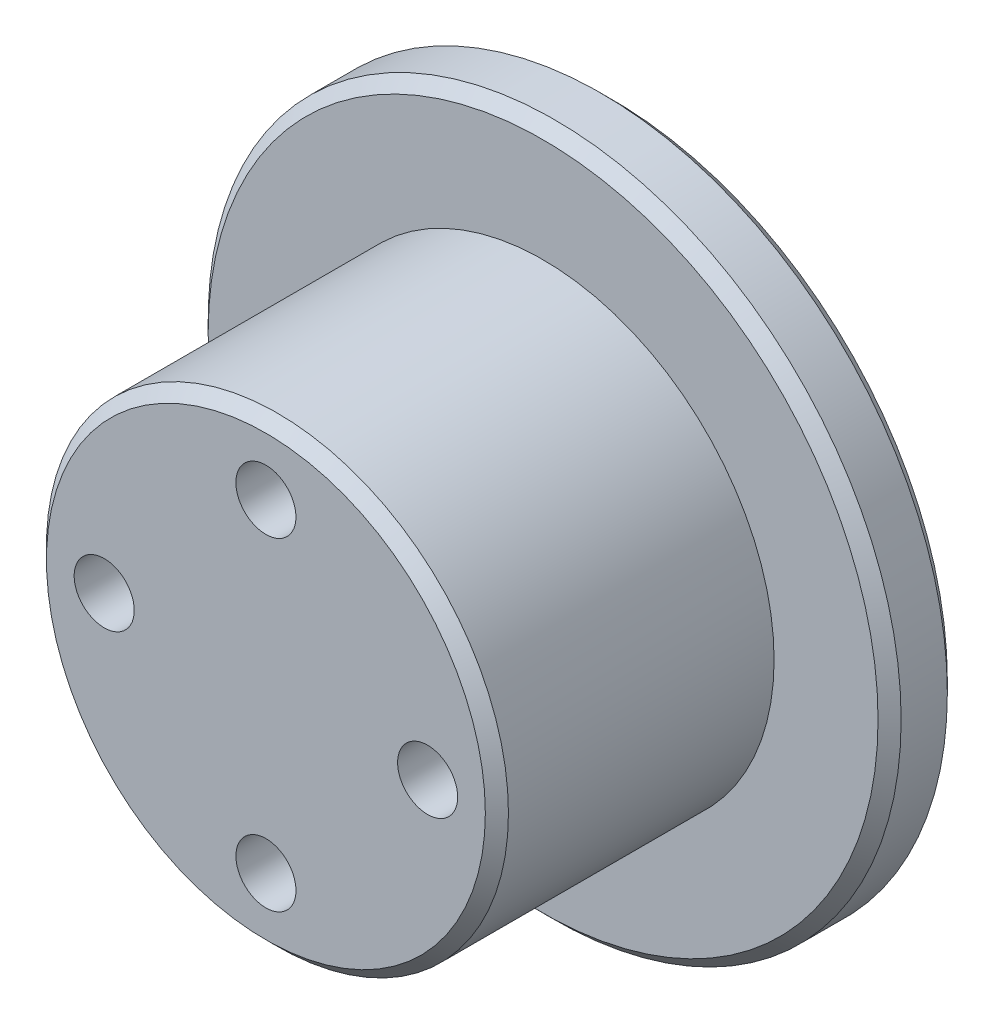
ISO-10303-21;
HEADER;
FILE_DESCRIPTION(('STEP AP214'),'2;1');
FILE_NAME('part.step','',(''),(''),'','','');
FILE_SCHEMA(('AUTOMOTIVE_DESIGN { 1 0 10303 214 1 1 1 1 }'));
ENDSEC;
DATA;
#1=APPLICATION_CONTEXT('core data for automotive mechanical design processes');
#2=APPLICATION_PROTOCOL_DEFINITION('international standard','automotive_design',2000,#1);
#3=PRODUCT_CONTEXT('',#1,'mechanical');
#4=PRODUCT('Part','Part','',(#3));
#5=PRODUCT_RELATED_PRODUCT_CATEGORY('part','',(#4));
#6=PRODUCT_DEFINITION_FORMATION('','',#4);
#7=PRODUCT_DEFINITION_CONTEXT('part definition',#1,'design');
#8=PRODUCT_DEFINITION('design','',#6,#7);
#9=PRODUCT_DEFINITION_SHAPE('','',#8);
#10=(LENGTH_UNIT() NAMED_UNIT(*) SI_UNIT(.MILLI.,.METRE.));
#11=(NAMED_UNIT(*) PLANE_ANGLE_UNIT() SI_UNIT($,.RADIAN.));
#12=(NAMED_UNIT(*) SI_UNIT($,.STERADIAN.) SOLID_ANGLE_UNIT());
#13=UNCERTAINTY_MEASURE_WITH_UNIT(LENGTH_MEASURE(1.E-05),#10,'distance_accuracy_value','');
#14=(GEOMETRIC_REPRESENTATION_CONTEXT(3) GLOBAL_UNCERTAINTY_ASSIGNED_CONTEXT((#13)) GLOBAL_UNIT_ASSIGNED_CONTEXT((#10,
#11,#12)) REPRESENTATION_CONTEXT('',''));
#15=CARTESIAN_POINT('',(0.,0.,0.));
#16=DIRECTION('',(0.,0.,1.));
#17=DIRECTION('',(1.,0.,0.));
#18=AXIS2_PLACEMENT_3D('',#15,#16,#17);
#19=CARTESIAN_POINT('',(0.,0.,3.));
#20=DIRECTION('',(0.,0.,-1.));
#21=DIRECTION('',(-1.,0.,0.));
#22=AXIS2_PLACEMENT_3D('',#19,#20,#21);
#23=CYLINDRICAL_SURFACE('',#22,15.);
#24=CARTESIAN_POINT('',(0.,0.,2.50000000000001));
#25=DIRECTION('',(0.,0.,1.));
#26=DIRECTION('',(1.,0.,0.));
#27=AXIS2_PLACEMENT_3D('',#24,#25,#26);
#28=CIRCLE('',#27,15.);
#29=CARTESIAN_POINT('',(15.,0.,2.50000000000001));
#30=VERTEX_POINT('',#29);
#31=EDGE_CURVE('E47',#30,#30,#28,.F.);
#32=ORIENTED_EDGE('',*,*,#31,.T.);
#33=EDGE_LOOP('',(#32));
#34=FACE_BOUND('',#33,.T.);
#35=CARTESIAN_POINT('',(0.,0.,0.500000000000002));
#36=DIRECTION('',(0.,0.,1.));
#37=DIRECTION('',(1.,0.,0.));
#38=AXIS2_PLACEMENT_3D('',#35,#36,#37);
#39=CIRCLE('',#38,15.);
#40=CARTESIAN_POINT('',(15.,0.,0.500000000000002));
#41=VERTEX_POINT('',#40);
#42=EDGE_CURVE('E52',#41,#41,#39,.T.);
#43=ORIENTED_EDGE('',*,*,#42,.T.);
#44=EDGE_LOOP('',(#43));
#45=FACE_BOUND('',#44,.T.);
#46=ADVANCED_FACE('F41',(#34,#45),#23,.T.);
#47=CARTESIAN_POINT('',(0.,0.,3.));
#48=DIRECTION('',(0.,0.,1.));
#49=DIRECTION('',(1.,0.,0.));
#50=AXIS2_PLACEMENT_3D('',#47,#48,#49);
#51=PLANE('',#50);
#52=CARTESIAN_POINT('',(0.,0.,3.));
#53=DIRECTION('',(0.,0.,1.));
#54=DIRECTION('',(1.,0.,0.));
#55=AXIS2_PLACEMENT_3D('',#52,#53,#54);
#56=CIRCLE('',#55,14.5);
#57=CARTESIAN_POINT('',(14.5,0.,3.));
#58=VERTEX_POINT('',#57);
#59=EDGE_CURVE('E60',#58,#58,#56,.T.);
#60=ORIENTED_EDGE('',*,*,#59,.T.);
#61=EDGE_LOOP('',(#60));
#62=FACE_BOUND('',#61,.T.);
#63=CARTESIAN_POINT('',(0.,0.,3.));
#64=DIRECTION('',(0.,0.,1.));
#65=DIRECTION('',(1.,0.,0.));
#66=AXIS2_PLACEMENT_3D('',#63,#64,#65);
#67=CIRCLE('',#66,10.);
#68=CARTESIAN_POINT('',(10.,0.,3.));
#69=VERTEX_POINT('',#68);
#70=EDGE_CURVE('E69',#69,#69,#67,.T.);
#71=ORIENTED_EDGE('',*,*,#70,.F.);
#72=EDGE_LOOP('',(#71));
#73=FACE_BOUND('',#72,.T.);
#74=ADVANCED_FACE('F130',(#62,#73),#51,.T.);
#75=CARTESIAN_POINT('',(0.,0.,0.));
#76=DIRECTION('',(0.,0.,1.));
#77=DIRECTION('',(1.,0.,0.));
#78=AXIS2_PLACEMENT_3D('',#75,#76,#77);
#79=PLANE('',#78);
#80=CARTESIAN_POINT('',(0.,0.,0.));
#81=DIRECTION('',(0.,0.,1.));
#82=DIRECTION('',(1.,0.,0.));
#83=AXIS2_PLACEMENT_3D('',#80,#81,#82);
#84=CIRCLE('',#83,14.5);
#85=CARTESIAN_POINT('',(14.5,0.,0.));
#86=VERTEX_POINT('',#85);
#87=EDGE_CURVE('E10',#86,#86,#84,.F.);
#88=ORIENTED_EDGE('',*,*,#87,.T.);
#89=EDGE_LOOP('',(#88));
#90=FACE_BOUND('',#89,.T.);
#91=CARTESIAN_POINT('',(0.,-5.,0.));
#92=DIRECTION('',(0.,0.,-1.));
#93=DIRECTION('',(-1.,0.,0.));
#94=AXIS2_PLACEMENT_3D('',#91,#92,#93);
#95=CIRCLE('',#94,2.);
#96=CARTESIAN_POINT('',(-2.,-5.,0.));
#97=VERTEX_POINT('',#96);
#98=EDGE_CURVE('E107',#97,#97,#95,.T.);
#99=ORIENTED_EDGE('',*,*,#98,.F.);
#100=EDGE_LOOP('',(#99));
#101=FACE_BOUND('',#100,.T.);
#102=CARTESIAN_POINT('',(4.32862701892218,2.50086602540381,0.));
#103=DIRECTION('',(0.,0.,-1.));
#104=DIRECTION('',(-1.,0.,0.));
#105=AXIS2_PLACEMENT_3D('',#102,#103,#104);
#106=CIRCLE('',#105,2.);
#107=CARTESIAN_POINT('',(2.32862701892218,2.50086602540381,0.));
#108=VERTEX_POINT('',#107);
#109=EDGE_CURVE('E105',#108,#108,#106,.T.);
#110=ORIENTED_EDGE('',*,*,#109,.F.);
#111=EDGE_LOOP('',(#110));
#112=FACE_BOUND('',#111,.T.);
#113=CARTESIAN_POINT('',(-4.33162701892222,2.49913397459618,0.));
#114=DIRECTION('',(0.,0.,-1.));
#115=DIRECTION('',(-1.,0.,0.));
#116=AXIS2_PLACEMENT_3D('',#113,#114,#115);
#117=CIRCLE('',#116,2.);
#118=CARTESIAN_POINT('',(-6.33162701892222,2.49913397459618,0.));
#119=VERTEX_POINT('',#118);
#120=EDGE_CURVE('E96',#119,#119,#117,.T.);
#121=ORIENTED_EDGE('',*,*,#120,.F.);
#122=EDGE_LOOP('',(#121));
#123=FACE_BOUND('',#122,.T.);
#124=ADVANCED_FACE('F124',(#90,#101,#112,#123),#79,.F.);
#125=CARTESIAN_POINT('',(0.,0.,15.));
#126=DIRECTION('',(0.,0.,-1.));
#127=DIRECTION('',(-1.,0.,0.));
#128=AXIS2_PLACEMENT_3D('',#125,#126,#127);
#129=CYLINDRICAL_SURFACE('',#128,10.);
#130=CARTESIAN_POINT('',(0.,0.,14.5));
#131=DIRECTION('',(0.,0.,1.));
#132=DIRECTION('',(1.,0.,0.));
#133=AXIS2_PLACEMENT_3D('',#130,#131,#132);
#134=CIRCLE('',#133,10.);
#135=CARTESIAN_POINT('',(10.,0.,14.5));
#136=VERTEX_POINT('',#135);
#137=EDGE_CURVE('E65',#136,#136,#134,.F.);
#138=ORIENTED_EDGE('',*,*,#137,.T.);
#139=EDGE_LOOP('',(#138));
#140=FACE_BOUND('',#139,.T.);
#141=ORIENTED_EDGE('',*,*,#70,.T.);
#142=EDGE_LOOP('',(#141));
#143=FACE_BOUND('',#142,.T.);
#144=ADVANCED_FACE('F127',(#140,#143),#129,.T.);
#145=CARTESIAN_POINT('',(0.,0.,15.));
#146=DIRECTION('',(0.,0.,1.));
#147=DIRECTION('',(1.,0.,0.));
#148=AXIS2_PLACEMENT_3D('',#145,#146,#147);
#149=PLANE('',#148);
#150=CARTESIAN_POINT('',(0.,0.,15.));
#151=DIRECTION('',(0.,0.,1.));
#152=DIRECTION('',(1.,0.,0.));
#153=AXIS2_PLACEMENT_3D('',#150,#151,#152);
#154=CIRCLE('',#153,9.49999999999999);
#155=CARTESIAN_POINT('',(9.49999999999999,0.,15.));
#156=VERTEX_POINT('',#155);
#157=EDGE_CURVE('E62',#156,#156,#154,.T.);
#158=ORIENTED_EDGE('',*,*,#157,.T.);
#159=EDGE_LOOP('',(#158));
#160=FACE_BOUND('',#159,.T.);
#161=CARTESIAN_POINT('',(-6.999,-0.000999999999926679,15.));
#162=DIRECTION('',(0.,0.,1.));
#163=DIRECTION('',(1.,0.,0.));
#164=AXIS2_PLACEMENT_3D('',#161,#162,#163);
#165=CIRCLE('',#164,1.3);
#166=CARTESIAN_POINT('',(-5.699,-0.000999999999926679,15.));
#167=VERTEX_POINT('',#166);
#168=EDGE_CURVE('E93',#167,#167,#165,.T.);
#169=ORIENTED_EDGE('',*,*,#168,.F.);
#170=EDGE_LOOP('',(#169));
#171=FACE_BOUND('',#170,.T.);
#172=CARTESIAN_POINT('',(0.,7.,15.));
#173=DIRECTION('',(0.,0.,1.));
#174=DIRECTION('',(1.,0.,0.));
#175=AXIS2_PLACEMENT_3D('',#172,#173,#174);
#176=CIRCLE('',#175,1.3);
#177=CARTESIAN_POINT('',(1.3,7.,15.));
#178=VERTEX_POINT('',#177);
#179=EDGE_CURVE('E83',#178,#178,#176,.T.);
#180=ORIENTED_EDGE('',*,*,#179,.F.);
#181=EDGE_LOOP('',(#180));
#182=FACE_BOUND('',#181,.T.);
#183=CARTESIAN_POINT('',(0.00199999999995112,-7.,15.));
#184=DIRECTION('',(0.,0.,1.));
#185=DIRECTION('',(1.,0.,0.));
#186=AXIS2_PLACEMENT_3D('',#183,#184,#185);
#187=CIRCLE('',#186,1.3);
#188=CARTESIAN_POINT('',(1.30199999999995,-7.,15.));
#189=VERTEX_POINT('',#188);
#190=EDGE_CURVE('E79',#189,#189,#187,.T.);
#191=ORIENTED_EDGE('',*,*,#190,.F.);
#192=EDGE_LOOP('',(#191));
#193=FACE_BOUND('',#192,.T.);
#194=CARTESIAN_POINT('',(7.001,0.00099999999997556,15.));
#195=DIRECTION('',(0.,0.,1.));
#196=DIRECTION('',(1.,0.,0.));
#197=AXIS2_PLACEMENT_3D('',#194,#195,#196);
#198=CIRCLE('',#197,1.3);
#199=CARTESIAN_POINT('',(8.301,0.00099999999997556,15.));
#200=VERTEX_POINT('',#199);
#201=EDGE_CURVE('E75',#200,#200,#198,.T.);
#202=ORIENTED_EDGE('',*,*,#201,.F.);
#203=EDGE_LOOP('',(#202));
#204=FACE_BOUND('',#203,.T.);
#205=ADVANCED_FACE('F185',(#160,#171,#182,#193,#204),#149,.T.);
#206=CARTESIAN_POINT('',(7.001,0.00099999999997556,9.));
#207=DIRECTION('',(0.,0.,1.));
#208=DIRECTION('',(1.,0.,0.));
#209=AXIS2_PLACEMENT_3D('',#206,#207,#208);
#210=CYLINDRICAL_SURFACE('',#209,1.3);
#211=CARTESIAN_POINT('',(7.001,0.00099999999997556,9.));
#212=DIRECTION('',(0.,0.,1.));
#213=DIRECTION('',(1.,0.,0.));
#214=AXIS2_PLACEMENT_3D('',#211,#212,#213);
#215=CIRCLE('',#214,1.3);
#216=CARTESIAN_POINT('',(8.301,0.00099999999997556,9.));
#217=VERTEX_POINT('',#216);
#218=EDGE_CURVE('E73',#217,#217,#215,.T.);
#219=ORIENTED_EDGE('',*,*,#218,.F.);
#220=EDGE_LOOP('',(#219));
#221=FACE_BOUND('',#220,.T.);
#222=ORIENTED_EDGE('',*,*,#201,.T.);
#223=EDGE_LOOP('',(#222));
#224=FACE_BOUND('',#223,.T.);
#225=ADVANCED_FACE('F186',(#221,#224),#210,.F.);
#226=CARTESIAN_POINT('',(0.,0.,9.));
#227=DIRECTION('',(0.,0.,1.));
#228=DIRECTION('',(1.,0.,0.));
#229=AXIS2_PLACEMENT_3D('',#226,#227,#228);
#230=PLANE('',#229);
#231=ORIENTED_EDGE('',*,*,#218,.T.);
#232=EDGE_LOOP('',(#231));
#233=FACE_BOUND('',#232,.T.);
#234=ADVANCED_FACE('F191',(#233),#230,.T.);
#235=CARTESIAN_POINT('',(0.00199999999995112,-7.,9.));
#236=DIRECTION('',(0.,0.,1.));
#237=DIRECTION('',(1.,0.,0.));
#238=AXIS2_PLACEMENT_3D('',#235,#236,#237);
#239=CYLINDRICAL_SURFACE('',#238,1.3);
#240=CARTESIAN_POINT('',(0.00199999999995112,-7.,9.));
#241=DIRECTION('',(0.,0.,1.));
#242=DIRECTION('',(1.,0.,0.));
#243=AXIS2_PLACEMENT_3D('',#240,#241,#242);
#244=CIRCLE('',#243,1.3);
#245=CARTESIAN_POINT('',(1.30199999999995,-7.,9.));
#246=VERTEX_POINT('',#245);
#247=EDGE_CURVE('E85',#246,#246,#244,.T.);
#248=ORIENTED_EDGE('',*,*,#247,.F.);
#249=EDGE_LOOP('',(#248));
#250=FACE_BOUND('',#249,.T.);
#251=ORIENTED_EDGE('',*,*,#190,.T.);
#252=EDGE_LOOP('',(#251));
#253=FACE_BOUND('',#252,.T.);
#254=ADVANCED_FACE('F196',(#250,#253),#239,.F.);
#255=CARTESIAN_POINT('',(0.,0.,9.));
#256=DIRECTION('',(0.,0.,1.));
#257=DIRECTION('',(1.,0.,0.));
#258=AXIS2_PLACEMENT_3D('',#255,#256,#257);
#259=PLANE('',#258);
#260=ORIENTED_EDGE('',*,*,#247,.T.);
#261=EDGE_LOOP('',(#260));
#262=FACE_BOUND('',#261,.T.);
#263=ADVANCED_FACE('F205',(#262),#259,.T.);
#264=CARTESIAN_POINT('',(0.,7.,9.));
#265=DIRECTION('',(0.,0.,1.));
#266=DIRECTION('',(1.,0.,0.));
#267=AXIS2_PLACEMENT_3D('',#264,#265,#266);
#268=CYLINDRICAL_SURFACE('',#267,1.3);
#269=CARTESIAN_POINT('',(0.,7.,9.));
#270=DIRECTION('',(0.,0.,1.));
#271=DIRECTION('',(1.,0.,0.));
#272=AXIS2_PLACEMENT_3D('',#269,#270,#271);
#273=CIRCLE('',#272,1.3);
#274=CARTESIAN_POINT('',(1.3,7.,9.));
#275=VERTEX_POINT('',#274);
#276=EDGE_CURVE('E86',#275,#275,#273,.T.);
#277=ORIENTED_EDGE('',*,*,#276,.F.);
#278=EDGE_LOOP('',(#277));
#279=FACE_BOUND('',#278,.T.);
#280=ORIENTED_EDGE('',*,*,#179,.T.);
#281=EDGE_LOOP('',(#280));
#282=FACE_BOUND('',#281,.T.);
#283=ADVANCED_FACE('F206',(#279,#282),#268,.F.);
#284=CARTESIAN_POINT('',(0.,0.,9.));
#285=DIRECTION('',(0.,0.,1.));
#286=DIRECTION('',(1.,0.,0.));
#287=AXIS2_PLACEMENT_3D('',#284,#285,#286);
#288=PLANE('',#287);
#289=ORIENTED_EDGE('',*,*,#276,.T.);
#290=EDGE_LOOP('',(#289));
#291=FACE_BOUND('',#290,.T.);
#292=ADVANCED_FACE('F209',(#291),#288,.T.);
#293=CARTESIAN_POINT('',(-6.999,-0.000999999999926679,9.));
#294=DIRECTION('',(0.,0.,1.));
#295=DIRECTION('',(1.,0.,0.));
#296=AXIS2_PLACEMENT_3D('',#293,#294,#295);
#297=CYLINDRICAL_SURFACE('',#296,1.3);
#298=CARTESIAN_POINT('',(-6.999,-0.000999999999926679,9.));
#299=DIRECTION('',(0.,0.,1.));
#300=DIRECTION('',(1.,0.,0.));
#301=AXIS2_PLACEMENT_3D('',#298,#299,#300);
#302=CIRCLE('',#301,1.3);
#303=CARTESIAN_POINT('',(-5.699,-0.000999999999926679,9.));
#304=VERTEX_POINT('',#303);
#305=EDGE_CURVE('E72',#304,#304,#302,.T.);
#306=ORIENTED_EDGE('',*,*,#305,.F.);
#307=EDGE_LOOP('',(#306));
#308=FACE_BOUND('',#307,.T.);
#309=ORIENTED_EDGE('',*,*,#168,.T.);
#310=EDGE_LOOP('',(#309));
#311=FACE_BOUND('',#310,.T.);
#312=ADVANCED_FACE('F148',(#308,#311),#297,.F.);
#313=CARTESIAN_POINT('',(0.,0.,9.));
#314=DIRECTION('',(0.,0.,1.));
#315=DIRECTION('',(1.,0.,0.));
#316=AXIS2_PLACEMENT_3D('',#313,#314,#315);
#317=PLANE('',#316);
#318=ORIENTED_EDGE('',*,*,#305,.T.);
#319=EDGE_LOOP('',(#318));
#320=FACE_BOUND('',#319,.T.);
#321=ADVANCED_FACE('F137',(#320),#317,.T.);
#322=CARTESIAN_POINT('',(-4.33162701892222,2.49913397459618,6.));
#323=DIRECTION('',(0.,0.,-1.));
#324=DIRECTION('',(-1.,0.,0.));
#325=AXIS2_PLACEMENT_3D('',#322,#323,#324);
#326=CYLINDRICAL_SURFACE('',#325,2.);
#327=CARTESIAN_POINT('',(-4.33162701892222,2.49913397459618,6.));
#328=DIRECTION('',(0.,0.,-1.));
#329=DIRECTION('',(-1.,0.,0.));
#330=AXIS2_PLACEMENT_3D('',#327,#328,#329);
#331=CIRCLE('',#330,2.);
#332=CARTESIAN_POINT('',(-6.33162701892222,2.49913397459618,6.));
#333=VERTEX_POINT('',#332);
#334=EDGE_CURVE('E97',#333,#333,#331,.T.);
#335=ORIENTED_EDGE('',*,*,#334,.F.);
#336=EDGE_LOOP('',(#335));
#337=FACE_BOUND('',#336,.T.);
#338=ORIENTED_EDGE('',*,*,#120,.T.);
#339=EDGE_LOOP('',(#338));
#340=FACE_BOUND('',#339,.T.);
#341=ADVANCED_FACE('F131',(#337,#340),#326,.F.);
#342=CARTESIAN_POINT('',(0.,0.,6.));
#343=DIRECTION('',(0.,0.,-1.));
#344=DIRECTION('',(-1.,0.,0.));
#345=AXIS2_PLACEMENT_3D('',#342,#343,#344);
#346=PLANE('',#345);
#347=ORIENTED_EDGE('',*,*,#334,.T.);
#348=EDGE_LOOP('',(#347));
#349=FACE_BOUND('',#348,.T.);
#350=ADVANCED_FACE('F132',(#349),#346,.T.);
#351=CARTESIAN_POINT('',(4.32862701892218,2.50086602540381,6.));
#352=DIRECTION('',(0.,0.,-1.));
#353=DIRECTION('',(-1.,0.,0.));
#354=AXIS2_PLACEMENT_3D('',#351,#352,#353);
#355=CYLINDRICAL_SURFACE('',#354,2.);
#356=CARTESIAN_POINT('',(4.32862701892218,2.50086602540381,6.));
#357=DIRECTION('',(0.,0.,-1.));
#358=DIRECTION('',(-1.,0.,0.));
#359=AXIS2_PLACEMENT_3D('',#356,#357,#358);
#360=CIRCLE('',#359,2.);
#361=CARTESIAN_POINT('',(2.32862701892218,2.50086602540381,6.));
#362=VERTEX_POINT('',#361);
#363=EDGE_CURVE('E104',#362,#362,#360,.T.);
#364=ORIENTED_EDGE('',*,*,#363,.F.);
#365=EDGE_LOOP('',(#364));
#366=FACE_BOUND('',#365,.T.);
#367=ORIENTED_EDGE('',*,*,#109,.T.);
#368=EDGE_LOOP('',(#367));
#369=FACE_BOUND('',#368,.T.);
#370=ADVANCED_FACE('F141',(#366,#369),#355,.F.);
#371=CARTESIAN_POINT('',(0.,0.,6.));
#372=DIRECTION('',(0.,0.,-1.));
#373=DIRECTION('',(-1.,0.,0.));
#374=AXIS2_PLACEMENT_3D('',#371,#372,#373);
#375=PLANE('',#374);
#376=ORIENTED_EDGE('',*,*,#363,.T.);
#377=EDGE_LOOP('',(#376));
#378=FACE_BOUND('',#377,.T.);
#379=ADVANCED_FACE('F119',(#378),#375,.T.);
#380=CARTESIAN_POINT('',(0.,-5.,6.));
#381=DIRECTION('',(0.,0.,-1.));
#382=DIRECTION('',(-1.,0.,0.));
#383=AXIS2_PLACEMENT_3D('',#380,#381,#382);
#384=CYLINDRICAL_SURFACE('',#383,2.);
#385=CARTESIAN_POINT('',(0.,-5.,6.));
#386=DIRECTION('',(0.,0.,-1.));
#387=DIRECTION('',(-1.,0.,0.));
#388=AXIS2_PLACEMENT_3D('',#385,#386,#387);
#389=CIRCLE('',#388,2.);
#390=CARTESIAN_POINT('',(-2.,-5.,6.));
#391=VERTEX_POINT('',#390);
#392=EDGE_CURVE('E78',#391,#391,#389,.T.);
#393=ORIENTED_EDGE('',*,*,#392,.F.);
#394=EDGE_LOOP('',(#393));
#395=FACE_BOUND('',#394,.T.);
#396=ORIENTED_EDGE('',*,*,#98,.T.);
#397=EDGE_LOOP('',(#396));
#398=FACE_BOUND('',#397,.T.);
#399=ADVANCED_FACE('F118',(#395,#398),#384,.F.);
#400=CARTESIAN_POINT('',(0.,0.,6.));
#401=DIRECTION('',(0.,0.,-1.));
#402=DIRECTION('',(-1.,0.,0.));
#403=AXIS2_PLACEMENT_3D('',#400,#401,#402);
#404=PLANE('',#403);
#405=ORIENTED_EDGE('',*,*,#392,.T.);
#406=EDGE_LOOP('',(#405));
#407=FACE_BOUND('',#406,.T.);
#408=ADVANCED_FACE('F111',(#407),#404,.T.);
#409=CARTESIAN_POINT('',(0.,0.,15.));
#410=DIRECTION('',(0.,0.,-1.));
#411=DIRECTION('',(-1.,0.,0.));
#412=AXIS2_PLACEMENT_3D('',#409,#410,#411);
#413=CONICAL_SURFACE('',#412,9.49999999999999,0.785398163397448);
#414=ORIENTED_EDGE('',*,*,#137,.F.);
#415=EDGE_LOOP('',(#414));
#416=FACE_BOUND('',#415,.T.);
#417=ORIENTED_EDGE('',*,*,#157,.F.);
#418=EDGE_LOOP('',(#417));
#419=FACE_BOUND('',#418,.T.);
#420=ADVANCED_FACE('F161',(#416,#419),#413,.T.);
#421=CARTESIAN_POINT('',(0.,0.,3.));
#422=DIRECTION('',(0.,0.,-1.));
#423=DIRECTION('',(-1.,0.,0.));
#424=AXIS2_PLACEMENT_3D('',#421,#422,#423);
#425=CONICAL_SURFACE('',#424,14.5,0.785398163397447);
#426=ORIENTED_EDGE('',*,*,#31,.F.);
#427=EDGE_LOOP('',(#426));
#428=FACE_BOUND('',#427,.T.);
#429=ORIENTED_EDGE('',*,*,#59,.F.);
#430=EDGE_LOOP('',(#429));
#431=FACE_BOUND('',#430,.T.);
#432=ADVANCED_FACE('F167',(#428,#431),#425,.T.);
#433=CARTESIAN_POINT('',(0.,0.,0.500000000000002));
#434=DIRECTION('',(0.,0.,1.));
#435=DIRECTION('',(1.,0.,0.));
#436=AXIS2_PLACEMENT_3D('',#433,#434,#435);
#437=CONICAL_SURFACE('',#436,15.,0.785398163397448);
#438=ORIENTED_EDGE('',*,*,#87,.F.);
#439=EDGE_LOOP('',(#438));
#440=FACE_BOUND('',#439,.T.);
#441=ORIENTED_EDGE('',*,*,#42,.F.);
#442=EDGE_LOOP('',(#441));
#443=FACE_BOUND('',#442,.T.);
#444=ADVANCED_FACE('F42',(#440,#443),#437,.T.);
#445=CLOSED_SHELL('',(#46,#74,#124,#144,#205,#225,#234,#254,#263,#283,#292,#312,#321,#341,#350,
#370,#379,#399,#408,#420,#432,#444));
#446=MANIFOLD_SOLID_BREP('B2',#445);
#447=ADVANCED_BREP_SHAPE_REPRESENTATION('',(#18,#446),#14);
#448=SHAPE_DEFINITION_REPRESENTATION(#9,#447);
ENDSEC;
END-ISO-10303-21;
